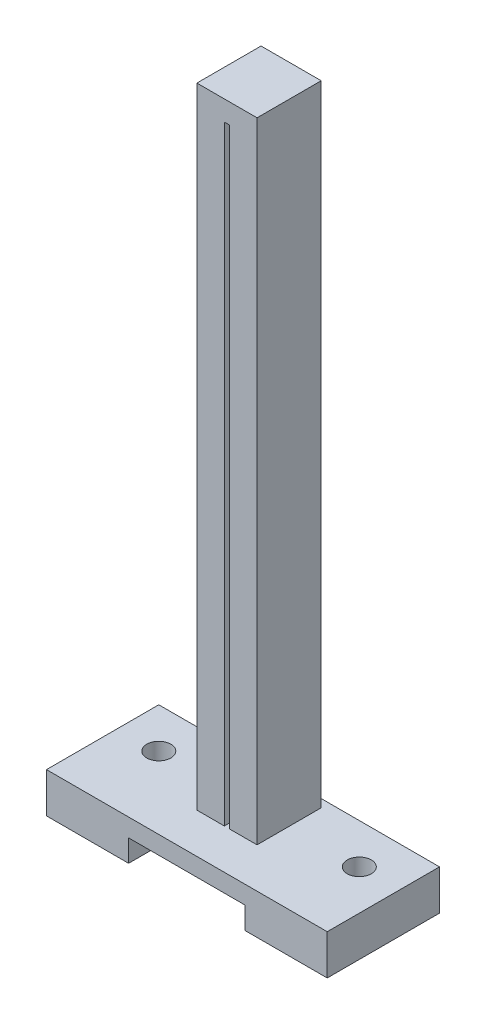
ISO-10303-21;
HEADER;
FILE_DESCRIPTION(('STEP AP214'),'2;1');
FILE_NAME('part.step','',(''),(''),'','','');
FILE_SCHEMA(('AUTOMOTIVE_DESIGN { 1 0 10303 214 1 1 1 1 }'));
ENDSEC;
DATA;
#1=APPLICATION_CONTEXT('core data for automotive mechanical design processes');
#2=APPLICATION_PROTOCOL_DEFINITION('international standard','automotive_design',2000,#1);
#3=PRODUCT_CONTEXT('',#1,'mechanical');
#4=PRODUCT('Part','Part','',(#3));
#5=PRODUCT_RELATED_PRODUCT_CATEGORY('part','',(#4));
#6=PRODUCT_DEFINITION_FORMATION('','',#4);
#7=PRODUCT_DEFINITION_CONTEXT('part definition',#1,'design');
#8=PRODUCT_DEFINITION('design','',#6,#7);
#9=PRODUCT_DEFINITION_SHAPE('','',#8);
#10=(LENGTH_UNIT() NAMED_UNIT(*) SI_UNIT(.MILLI.,.METRE.));
#11=(NAMED_UNIT(*) PLANE_ANGLE_UNIT() SI_UNIT($,.RADIAN.));
#12=(NAMED_UNIT(*) SI_UNIT($,.STERADIAN.) SOLID_ANGLE_UNIT());
#13=UNCERTAINTY_MEASURE_WITH_UNIT(LENGTH_MEASURE(1.E-05),#10,'distance_accuracy_value','');
#14=(GEOMETRIC_REPRESENTATION_CONTEXT(3) GLOBAL_UNCERTAINTY_ASSIGNED_CONTEXT((#13)) GLOBAL_UNIT_ASSIGNED_CONTEXT((#10,
#11,#12)) REPRESENTATION_CONTEXT('',''));
#15=CARTESIAN_POINT('',(0.,0.,0.));
#16=DIRECTION('',(0.,0.,1.));
#17=DIRECTION('',(1.,0.,0.));
#18=AXIS2_PLACEMENT_3D('',#15,#16,#17);
#19=CARTESIAN_POINT('',(-5.,5.5,21.5));
#20=DIRECTION('',(-1.,0.,0.));
#21=DIRECTION('',(0.,-1.,0.));
#22=AXIS2_PLACEMENT_3D('',#19,#20,#21);
#23=PLANE('',#22);
#24=DIRECTION('',(0.,1.,0.));
#25=VECTOR('',#24,1.);
#26=CARTESIAN_POINT('',(-5.,5.5,-13.5));
#27=LINE('',#26,#25);
#28=CARTESIAN_POINT('',(-5.,0.,-13.5));
#29=VERTEX_POINT('',#28);
#30=CARTESIAN_POINT('',(-5.,5.5,-13.5));
#31=VERTEX_POINT('',#30);
#32=EDGE_CURVE('E256',#29,#31,#27,.T.);
#33=ORIENTED_EDGE('',*,*,#32,.F.);
#34=DIRECTION('',(0.,0.,1.));
#35=VECTOR('',#34,1.);
#36=CARTESIAN_POINT('',(-5.,0.,0.));
#37=LINE('',#36,#35);
#38=CARTESIAN_POINT('',(-5.,0.,-21.5));
#39=VERTEX_POINT('',#38);
#40=EDGE_CURVE('E423',#39,#29,#37,.T.);
#41=ORIENTED_EDGE('',*,*,#40,.F.);
#42=DIRECTION('',(0.,1.,0.));
#43=VECTOR('',#42,1.);
#44=CARTESIAN_POINT('',(-5.,5.5,-21.5));
#45=LINE('',#44,#43);
#46=CARTESIAN_POINT('',(-5.,5.5,-21.5));
#47=VERTEX_POINT('',#46);
#48=EDGE_CURVE('E304',#39,#47,#45,.T.);
#49=ORIENTED_EDGE('',*,*,#48,.T.);
#50=DIRECTION('',(0.,0.,-1.));
#51=VECTOR('',#50,1.);
#52=CARTESIAN_POINT('',(-5.,5.5,21.5));
#53=LINE('',#52,#51);
#54=EDGE_CURVE('E313',#31,#47,#53,.T.);
#55=ORIENTED_EDGE('',*,*,#54,.F.);
#56=EDGE_LOOP('',(#33,#41,#49,#55));
#57=FACE_BOUND('',#56,.T.);
#58=ADVANCED_FACE('F32',(#57),#23,.F.);
#59=CARTESIAN_POINT('',(5.,5.5,21.5));
#60=DIRECTION('',(1.,0.,0.));
#61=DIRECTION('',(0.,1.,0.));
#62=AXIS2_PLACEMENT_3D('',#59,#60,#61);
#63=PLANE('',#62);
#64=DIRECTION('',(0.,-1.,0.));
#65=VECTOR('',#64,1.);
#66=CARTESIAN_POINT('',(5.,5.5,-13.5));
#67=LINE('',#66,#65);
#68=CARTESIAN_POINT('',(5.,5.5,-13.5));
#69=VERTEX_POINT('',#68);
#70=CARTESIAN_POINT('',(5.,0.,-13.5));
#71=VERTEX_POINT('',#70);
#72=EDGE_CURVE('E253',#69,#71,#67,.T.);
#73=ORIENTED_EDGE('',*,*,#72,.F.);
#74=DIRECTION('',(0.,0.,-1.));
#75=VECTOR('',#74,1.);
#76=CARTESIAN_POINT('',(5.,5.5,21.5));
#77=LINE('',#76,#75);
#78=CARTESIAN_POINT('',(5.,5.5,-21.5));
#79=VERTEX_POINT('',#78);
#80=EDGE_CURVE('E240',#69,#79,#77,.T.);
#81=ORIENTED_EDGE('',*,*,#80,.T.);
#82=DIRECTION('',(0.,-1.,0.));
#83=VECTOR('',#82,1.);
#84=CARTESIAN_POINT('',(5.,5.5,-21.5));
#85=LINE('',#84,#83);
#86=CARTESIAN_POINT('',(5.,0.,-21.5));
#87=VERTEX_POINT('',#86);
#88=EDGE_CURVE('E310',#79,#87,#85,.T.);
#89=ORIENTED_EDGE('',*,*,#88,.T.);
#90=DIRECTION('',(0.,0.,-1.));
#91=VECTOR('',#90,1.);
#92=CARTESIAN_POINT('',(5.,0.,0.));
#93=LINE('',#92,#91);
#94=EDGE_CURVE('E421',#71,#87,#93,.T.);
#95=ORIENTED_EDGE('',*,*,#94,.F.);
#96=EDGE_LOOP('',(#73,#81,#89,#95));
#97=FACE_BOUND('',#96,.T.);
#98=ADVANCED_FACE('F509',(#97),#63,.F.);
#99=CARTESIAN_POINT('',(0.,0.,0.));
#100=DIRECTION('',(0.,1.,0.));
#101=DIRECTION('',(0.,0.,1.));
#102=AXIS2_PLACEMENT_3D('',#99,#100,#101);
#103=PLANE('',#102);
#104=CARTESIAN_POINT('',(-25.,0.,-11.5));
#105=DIRECTION('',(0.,1.,0.));
#106=DIRECTION('',(0.,0.,1.));
#107=AXIS2_PLACEMENT_3D('',#104,#105,#106);
#108=CIRCLE('',#107,3.);
#109=CARTESIAN_POINT('',(-25.,0.,-8.5));
#110=VERTEX_POINT('',#109);
#111=EDGE_CURVE('E387',#110,#110,#108,.T.);
#112=ORIENTED_EDGE('',*,*,#111,.T.);
#113=EDGE_LOOP('',(#112));
#114=FACE_BOUND('',#113,.T.);
#115=DIRECTION('',(1.,0.,0.));
#116=VECTOR('',#115,1.);
#117=CARTESIAN_POINT('',(0.,0.,-13.5));
#118=LINE('',#117,#116);
#119=CARTESIAN_POINT('',(-14.5226475214995,0.,-13.5));
#120=VERTEX_POINT('',#119);
#121=EDGE_CURVE('E258',#120,#29,#118,.T.);
#122=ORIENTED_EDGE('',*,*,#121,.F.);
#123=DIRECTION('',(0.,0.,1.));
#124=VECTOR('',#123,1.);
#125=CARTESIAN_POINT('',(-14.5226475214995,0.,0.));
#126=LINE('',#125,#124);
#127=CARTESIAN_POINT('',(-14.5226475214995,0.,6.5));
#128=VERTEX_POINT('',#127);
#129=EDGE_CURVE('E247',#120,#128,#126,.T.);
#130=ORIENTED_EDGE('',*,*,#129,.T.);
#131=DIRECTION('',(-1.,0.,0.));
#132=VECTOR('',#131,1.);
#133=CARTESIAN_POINT('',(35.,0.,6.49999999999999));
#134=LINE('',#133,#132);
#135=CARTESIAN_POINT('',(-35.,0.,6.5));
#136=VERTEX_POINT('',#135);
#137=EDGE_CURVE('E299',#128,#136,#134,.T.);
#138=ORIENTED_EDGE('',*,*,#137,.T.);
#139=DIRECTION('',(0.,0.,1.));
#140=VECTOR('',#139,1.);
#141=CARTESIAN_POINT('',(-35.,0.,-21.5));
#142=LINE('',#141,#140);
#143=CARTESIAN_POINT('',(-35.,0.,-21.5));
#144=VERTEX_POINT('',#143);
#145=EDGE_CURVE('E396',#144,#136,#142,.T.);
#146=ORIENTED_EDGE('',*,*,#145,.F.);
#147=DIRECTION('',(-1.,0.,0.));
#148=VECTOR('',#147,1.);
#149=CARTESIAN_POINT('',(-35.,0.,-21.5));
#150=LINE('',#149,#148);
#151=EDGE_CURVE('E403',#39,#144,#150,.T.);
#152=ORIENTED_EDGE('',*,*,#151,.F.);
#153=ORIENTED_EDGE('',*,*,#40,.T.);
#154=EDGE_LOOP('',(#122,#130,#138,#146,#152,#153));
#155=FACE_BOUND('',#154,.T.);
#156=ADVANCED_FACE('F515',(#114,#155),#103,.F.);
#157=CARTESIAN_POINT('',(0.,10.,0.));
#158=DIRECTION('',(0.,1.,0.));
#159=DIRECTION('',(0.,0.,1.));
#160=AXIS2_PLACEMENT_3D('',#157,#158,#159);
#161=PLANE('',#160);
#162=DIRECTION('',(-1.,0.,0.));
#163=VECTOR('',#162,1.);
#164=CARTESIAN_POINT('',(35.,10.,6.49999999999999));
#165=LINE('',#164,#163);
#166=CARTESIAN_POINT('',(35.,10.,6.49999999999999));
#167=VERTEX_POINT('',#166);
#168=CARTESIAN_POINT('',(-35.,10.,6.5));
#169=VERTEX_POINT('',#168);
#170=EDGE_CURVE('E294',#167,#169,#165,.T.);
#171=ORIENTED_EDGE('',*,*,#170,.F.);
#172=DIRECTION('',(0.,0.,-1.));
#173=VECTOR('',#172,1.);
#174=CARTESIAN_POINT('',(35.,10.,-21.5));
#175=LINE('',#174,#173);
#176=CARTESIAN_POINT('',(35.,10.,-21.5));
#177=VERTEX_POINT('',#176);
#178=EDGE_CURVE('E393',#167,#177,#175,.T.);
#179=ORIENTED_EDGE('',*,*,#178,.T.);
#180=DIRECTION('',(-1.,0.,0.));
#181=VECTOR('',#180,1.);
#182=CARTESIAN_POINT('',(-35.,10.,-21.5));
#183=LINE('',#182,#181);
#184=CARTESIAN_POINT('',(-35.,10.,-21.5));
#185=VERTEX_POINT('',#184);
#186=EDGE_CURVE('E395',#177,#185,#183,.T.);
#187=ORIENTED_EDGE('',*,*,#186,.T.);
#188=DIRECTION('',(0.,0.,1.));
#189=VECTOR('',#188,1.);
#190=CARTESIAN_POINT('',(-35.,10.,-21.5));
#191=LINE('',#190,#189);
#192=EDGE_CURVE('E398',#185,#169,#191,.T.);
#193=ORIENTED_EDGE('',*,*,#192,.T.);
#194=EDGE_LOOP('',(#171,#179,#187,#193));
#195=FACE_BOUND('',#194,.T.);
#196=DIRECTION('',(-1.,0.,0.));
#197=VECTOR('',#196,1.);
#198=CARTESIAN_POINT('',(-3.825,10.,-17.5000000000061));
#199=LINE('',#198,#197);
#200=CARTESIAN_POINT('',(0.650000000006676,10.,-17.5000000000061));
#201=VERTEX_POINT('',#200);
#202=CARTESIAN_POINT('',(-0.649999999993325,10.,-17.5000000000061));
#203=VERTEX_POINT('',#202);
#204=EDGE_CURVE('E325',#201,#203,#199,.T.);
#205=ORIENTED_EDGE('',*,*,#204,.F.);
#206=DIRECTION('',(0.,0.,1.));
#207=VECTOR('',#206,1.);
#208=CARTESIAN_POINT('',(0.650000000006675,10.,-21.5));
#209=LINE('',#208,#207);
#210=CARTESIAN_POINT('',(0.650000000006675,10.,-19.5000000000061));
#211=VERTEX_POINT('',#210);
#212=EDGE_CURVE('E334',#211,#201,#209,.T.);
#213=ORIENTED_EDGE('',*,*,#212,.F.);
#214=DIRECTION('',(-1.,0.,0.));
#215=VECTOR('',#214,1.);
#216=CARTESIAN_POINT('',(-7.4999999999967,10.,-19.5000000000061));
#217=LINE('',#216,#215);
#218=CARTESIAN_POINT('',(7.5000000000033,10.,-19.5000000000061));
#219=VERTEX_POINT('',#218);
#220=EDGE_CURVE('E348',#219,#211,#217,.T.);
#221=ORIENTED_EDGE('',*,*,#220,.F.);
#222=DIRECTION('',(0.,0.,-1.));
#223=VECTOR('',#222,1.);
#224=CARTESIAN_POINT('',(7.5000000000033,10.,-17.5000000000061));
#225=LINE('',#224,#223);
#226=CARTESIAN_POINT('',(7.50000000000331,10.,-3.50000000000614));
#227=VERTEX_POINT('',#226);
#228=EDGE_CURVE('E374',#227,#219,#225,.T.);
#229=ORIENTED_EDGE('',*,*,#228,.F.);
#230=DIRECTION('',(1.,0.,0.));
#231=VECTOR('',#230,1.);
#232=CARTESIAN_POINT('',(-7.49999999999669,10.,-3.50000000000614));
#233=LINE('',#232,#231);
#234=CARTESIAN_POINT('',(0.650000000006675,10.,-3.50000000000614));
#235=VERTEX_POINT('',#234);
#236=EDGE_CURVE('E355',#235,#227,#233,.T.);
#237=ORIENTED_EDGE('',*,*,#236,.F.);
#238=CARTESIAN_POINT('',(0.650000000006676,10.,-5.50000000000614));
#239=VERTEX_POINT('',#238);
#240=EDGE_CURVE('E332',#239,#235,#209,.T.);
#241=ORIENTED_EDGE('',*,*,#240,.F.);
#242=DIRECTION('',(1.,0.,0.));
#243=VECTOR('',#242,1.);
#244=CARTESIAN_POINT('',(-3.825,10.,-5.50000000000614));
#245=LINE('',#244,#243);
#246=CARTESIAN_POINT('',(-0.649999999993326,10.,-5.50000000000614));
#247=VERTEX_POINT('',#246);
#248=EDGE_CURVE('E323',#247,#239,#245,.T.);
#249=ORIENTED_EDGE('',*,*,#248,.F.);
#250=DIRECTION('',(0.,0.,1.));
#251=VECTOR('',#250,1.);
#252=CARTESIAN_POINT('',(-0.649999999993325,10.,-21.5));
#253=LINE('',#252,#251);
#254=CARTESIAN_POINT('',(-0.649999999993325,10.,-3.50000000000614));
#255=VERTEX_POINT('',#254);
#256=EDGE_CURVE('E331',#247,#255,#253,.T.);
#257=ORIENTED_EDGE('',*,*,#256,.T.);
#258=CARTESIAN_POINT('',(-7.49999999999669,10.,-3.50000000000614));
#259=VERTEX_POINT('',#258);
#260=EDGE_CURVE('E356',#259,#255,#233,.T.);
#261=ORIENTED_EDGE('',*,*,#260,.F.);
#262=DIRECTION('',(0.,0.,1.));
#263=VECTOR('',#262,1.);
#264=CARTESIAN_POINT('',(-7.4999999999967,10.,-17.5000000000061));
#265=LINE('',#264,#263);
#266=CARTESIAN_POINT('',(-7.4999999999967,10.,-19.5000000000061));
#267=VERTEX_POINT('',#266);
#268=EDGE_CURVE('E377',#267,#259,#265,.T.);
#269=ORIENTED_EDGE('',*,*,#268,.F.);
#270=CARTESIAN_POINT('',(-0.649999999993326,10.,-19.5000000000061));
#271=VERTEX_POINT('',#270);
#272=EDGE_CURVE('E347',#271,#267,#217,.T.);
#273=ORIENTED_EDGE('',*,*,#272,.F.);
#274=EDGE_CURVE('E335',#271,#203,#253,.T.);
#275=ORIENTED_EDGE('',*,*,#274,.T.);
#276=EDGE_LOOP('',(#205,#213,#221,#229,#237,#241,#249,#257,#261,#269,#273,#275));
#277=FACE_BOUND('',#276,.T.);
#278=CARTESIAN_POINT('',(25.,10.,-11.5));
#279=DIRECTION('',(0.,1.,0.));
#280=DIRECTION('',(0.,0.,1.));
#281=AXIS2_PLACEMENT_3D('',#278,#279,#280);
#282=CIRCLE('',#281,3.);
#283=CARTESIAN_POINT('',(25.,10.,-8.5));
#284=VERTEX_POINT('',#283);
#285=EDGE_CURVE('E380',#284,#284,#282,.T.);
#286=ORIENTED_EDGE('',*,*,#285,.F.);
#287=EDGE_LOOP('',(#286));
#288=FACE_BOUND('',#287,.T.);
#289=CARTESIAN_POINT('',(-25.,10.,-11.5));
#290=DIRECTION('',(0.,1.,0.));
#291=DIRECTION('',(0.,0.,1.));
#292=AXIS2_PLACEMENT_3D('',#289,#290,#291);
#293=CIRCLE('',#292,3.);
#294=CARTESIAN_POINT('',(-25.,10.,-8.5));
#295=VERTEX_POINT('',#294);
#296=EDGE_CURVE('E384',#295,#295,#293,.T.);
#297=ORIENTED_EDGE('',*,*,#296,.F.);
#298=EDGE_LOOP('',(#297));
#299=FACE_BOUND('',#298,.T.);
#300=ADVANCED_FACE('F467',(#195,#277,#288,#299),#161,.T.);
#301=CARTESIAN_POINT('',(35.,10.,-21.5));
#302=DIRECTION('',(-1.,0.,0.));
#303=DIRECTION('',(0.,0.,1.));
#304=AXIS2_PLACEMENT_3D('',#301,#302,#303);
#305=PLANE('',#304);
#306=ORIENTED_EDGE('',*,*,#178,.F.);
#307=DIRECTION('',(0.,1.,0.));
#308=VECTOR('',#307,1.);
#309=CARTESIAN_POINT('',(35.,0.,6.49999999999999));
#310=LINE('',#309,#308);
#311=CARTESIAN_POINT('',(35.,0.,6.49999999999999));
#312=VERTEX_POINT('',#311);
#313=EDGE_CURVE('E298',#312,#167,#310,.T.);
#314=ORIENTED_EDGE('',*,*,#313,.F.);
#315=DIRECTION('',(0.,0.,-1.));
#316=VECTOR('',#315,1.);
#317=CARTESIAN_POINT('',(35.,0.,-21.5));
#318=LINE('',#317,#316);
#319=CARTESIAN_POINT('',(35.,0.,-21.5));
#320=VERTEX_POINT('',#319);
#321=EDGE_CURVE('E390',#312,#320,#318,.T.);
#322=ORIENTED_EDGE('',*,*,#321,.T.);
#323=DIRECTION('',(0.,-1.,0.));
#324=VECTOR('',#323,1.);
#325=CARTESIAN_POINT('',(35.,10.,-21.5));
#326=LINE('',#325,#324);
#327=EDGE_CURVE('E411',#177,#320,#326,.T.);
#328=ORIENTED_EDGE('',*,*,#327,.F.);
#329=EDGE_LOOP('',(#306,#314,#322,#328));
#330=FACE_BOUND('',#329,.T.);
#331=ADVANCED_FACE('F34',(#330),#305,.F.);
#332=CARTESIAN_POINT('',(-35.,10.,-21.5));
#333=DIRECTION('',(0.,0.,1.));
#334=DIRECTION('',(1.,0.,0.));
#335=AXIS2_PLACEMENT_3D('',#332,#333,#334);
#336=PLANE('',#335);
#337=DIRECTION('',(1.,0.,0.));
#338=VECTOR('',#337,1.);
#339=CARTESIAN_POINT('',(5.,5.5,-21.5));
#340=LINE('',#339,#338);
#341=EDGE_CURVE('E308',#47,#79,#340,.T.);
#342=ORIENTED_EDGE('',*,*,#341,.F.);
#343=ORIENTED_EDGE('',*,*,#48,.F.);
#344=ORIENTED_EDGE('',*,*,#151,.T.);
#345=DIRECTION('',(0.,-1.,0.));
#346=VECTOR('',#345,1.);
#347=CARTESIAN_POINT('',(-35.,10.,-21.5));
#348=LINE('',#347,#346);
#349=EDGE_CURVE('E401',#185,#144,#348,.T.);
#350=ORIENTED_EDGE('',*,*,#349,.F.);
#351=ORIENTED_EDGE('',*,*,#186,.F.);
#352=ORIENTED_EDGE('',*,*,#327,.T.);
#353=EDGE_CURVE('E404',#320,#87,#150,.T.);
#354=ORIENTED_EDGE('',*,*,#353,.T.);
#355=ORIENTED_EDGE('',*,*,#88,.F.);
#356=EDGE_LOOP('',(#342,#343,#344,#350,#351,#352,#354,#355));
#357=FACE_BOUND('',#356,.T.);
#358=ADVANCED_FACE('F560',(#357),#336,.F.);
#359=CARTESIAN_POINT('',(-35.,10.,-21.5));
#360=DIRECTION('',(1.,0.,0.));
#361=DIRECTION('',(0.,0.,-1.));
#362=AXIS2_PLACEMENT_3D('',#359,#360,#361);
#363=PLANE('',#362);
#364=ORIENTED_EDGE('',*,*,#145,.T.);
#365=DIRECTION('',(0.,1.,0.));
#366=VECTOR('',#365,1.);
#367=CARTESIAN_POINT('',(-35.,0.,6.5));
#368=LINE('',#367,#366);
#369=EDGE_CURVE('E301',#136,#169,#368,.T.);
#370=ORIENTED_EDGE('',*,*,#369,.T.);
#371=ORIENTED_EDGE('',*,*,#192,.F.);
#372=ORIENTED_EDGE('',*,*,#349,.T.);
#373=EDGE_LOOP('',(#364,#370,#371,#372));
#374=FACE_BOUND('',#373,.T.);
#375=ADVANCED_FACE('F564',(#374),#363,.F.);
#376=CARTESIAN_POINT('',(25.,0.,-11.5));
#377=DIRECTION('',(0.,1.,0.));
#378=DIRECTION('',(0.,0.,1.));
#379=AXIS2_PLACEMENT_3D('',#376,#377,#378);
#380=CIRCLE('',#379,3.);
#381=CARTESIAN_POINT('',(25.,0.,-8.5));
#382=VERTEX_POINT('',#381);
#383=EDGE_CURVE('E381',#382,#382,#380,.T.);
#384=ORIENTED_EDGE('',*,*,#383,.T.);
#385=EDGE_LOOP('',(#384));
#386=FACE_BOUND('',#385,.T.);
#387=CARTESIAN_POINT('',(14.5226475214995,0.,6.5));
#388=VERTEX_POINT('',#387);
#389=EDGE_CURVE('E295',#312,#388,#134,.T.);
#390=ORIENTED_EDGE('',*,*,#389,.T.);
#391=DIRECTION('',(0.,0.,-1.));
#392=VECTOR('',#391,1.);
#393=CARTESIAN_POINT('',(14.5226475214995,0.,0.));
#394=LINE('',#393,#392);
#395=CARTESIAN_POINT('',(14.5226475214995,0.,-13.5));
#396=VERTEX_POINT('',#395);
#397=EDGE_CURVE('E251',#388,#396,#394,.T.);
#398=ORIENTED_EDGE('',*,*,#397,.T.);
#399=DIRECTION('',(1.,0.,0.));
#400=VECTOR('',#399,1.);
#401=CARTESIAN_POINT('',(0.,0.,-13.5));
#402=LINE('',#401,#400);
#403=EDGE_CURVE('E224',#71,#396,#402,.T.);
#404=ORIENTED_EDGE('',*,*,#403,.F.);
#405=ORIENTED_EDGE('',*,*,#94,.T.);
#406=ORIENTED_EDGE('',*,*,#353,.F.);
#407=ORIENTED_EDGE('',*,*,#321,.F.);
#408=EDGE_LOOP('',(#390,#398,#404,#405,#406,#407));
#409=FACE_BOUND('',#408,.T.);
#410=ADVANCED_FACE('F575',(#386,#409),#103,.F.);
#411=CARTESIAN_POINT('',(-25.,0.,-11.5));
#412=DIRECTION('',(0.,1.,0.));
#413=DIRECTION('',(0.,0.,1.));
#414=AXIS2_PLACEMENT_3D('',#411,#412,#413);
#415=CYLINDRICAL_SURFACE('',#414,3.);
#416=ORIENTED_EDGE('',*,*,#111,.F.);
#417=EDGE_LOOP('',(#416));
#418=FACE_BOUND('',#417,.T.);
#419=ORIENTED_EDGE('',*,*,#296,.T.);
#420=EDGE_LOOP('',(#419));
#421=FACE_BOUND('',#420,.T.);
#422=ADVANCED_FACE('F580',(#418,#421),#415,.F.);
#423=CARTESIAN_POINT('',(25.,0.,-11.5));
#424=DIRECTION('',(0.,1.,0.));
#425=DIRECTION('',(0.,0.,1.));
#426=AXIS2_PLACEMENT_3D('',#423,#424,#425);
#427=CYLINDRICAL_SURFACE('',#426,3.);
#428=ORIENTED_EDGE('',*,*,#383,.F.);
#429=EDGE_LOOP('',(#428));
#430=FACE_BOUND('',#429,.T.);
#431=ORIENTED_EDGE('',*,*,#285,.T.);
#432=EDGE_LOOP('',(#431));
#433=FACE_BOUND('',#432,.T.);
#434=ADVANCED_FACE('F587',(#430,#433),#427,.F.);
#435=CARTESIAN_POINT('',(7.5000000000033,210.,-17.5000000000061));
#436=DIRECTION('',(-1.,0.,0.));
#437=DIRECTION('',(0.,0.,1.));
#438=AXIS2_PLACEMENT_3D('',#435,#436,#437);
#439=PLANE('',#438);
#440=DIRECTION('',(0.,-1.,0.));
#441=VECTOR('',#440,1.);
#442=CARTESIAN_POINT('',(7.5000000000033,210.,-19.5000000000061));
#443=LINE('',#442,#441);
#444=CARTESIAN_POINT('',(7.5000000000033,167.,-19.5000000000061));
#445=VERTEX_POINT('',#444);
#446=EDGE_CURVE('E353',#445,#219,#443,.T.);
#447=ORIENTED_EDGE('',*,*,#446,.F.);
#448=DIRECTION('',(0.,0.,-1.));
#449=VECTOR('',#448,1.);
#450=CARTESIAN_POINT('',(7.5000000000033,167.,-3.50000000000614));
#451=LINE('',#450,#449);
#452=CARTESIAN_POINT('',(7.5000000000033,167.,-3.50000000000614));
#453=VERTEX_POINT('',#452);
#454=EDGE_CURVE('E268',#453,#445,#451,.T.);
#455=ORIENTED_EDGE('',*,*,#454,.F.);
#456=DIRECTION('',(0.,-1.,0.));
#457=VECTOR('',#456,1.);
#458=CARTESIAN_POINT('',(7.50000000000331,210.,-3.50000000000614));
#459=LINE('',#458,#457);
#460=EDGE_CURVE('E359',#453,#227,#459,.T.);
#461=ORIENTED_EDGE('',*,*,#460,.T.);
#462=ORIENTED_EDGE('',*,*,#228,.T.);
#463=EDGE_LOOP('',(#447,#455,#461,#462));
#464=FACE_BOUND('',#463,.T.);
#465=ADVANCED_FACE('F477',(#464),#439,.F.);
#466=CARTESIAN_POINT('',(-7.4999999999967,210.,-17.5000000000061));
#467=DIRECTION('',(1.,0.,0.));
#468=DIRECTION('',(0.,0.,-1.));
#469=AXIS2_PLACEMENT_3D('',#466,#467,#468);
#470=PLANE('',#469);
#471=DIRECTION('',(0.,-1.,0.));
#472=VECTOR('',#471,1.);
#473=CARTESIAN_POINT('',(-7.49999999999669,210.,-3.50000000000614));
#474=LINE('',#473,#472);
#475=CARTESIAN_POINT('',(-7.4999999999967,167.,-3.50000000000614));
#476=VERTEX_POINT('',#475);
#477=EDGE_CURVE('E361',#476,#259,#474,.T.);
#478=ORIENTED_EDGE('',*,*,#477,.F.);
#479=DIRECTION('',(0.,0.,1.));
#480=VECTOR('',#479,1.);
#481=CARTESIAN_POINT('',(-7.4999999999967,167.,-3.50000000000614));
#482=LINE('',#481,#480);
#483=CARTESIAN_POINT('',(-7.4999999999967,167.,-19.5000000000061));
#484=VERTEX_POINT('',#483);
#485=EDGE_CURVE('E261',#484,#476,#482,.T.);
#486=ORIENTED_EDGE('',*,*,#485,.F.);
#487=DIRECTION('',(0.,-1.,0.));
#488=VECTOR('',#487,1.);
#489=CARTESIAN_POINT('',(-7.4999999999967,210.,-19.5000000000061));
#490=LINE('',#489,#488);
#491=EDGE_CURVE('E351',#484,#267,#490,.T.);
#492=ORIENTED_EDGE('',*,*,#491,.T.);
#493=ORIENTED_EDGE('',*,*,#268,.T.);
#494=EDGE_LOOP('',(#478,#486,#492,#493));
#495=FACE_BOUND('',#494,.T.);
#496=ADVANCED_FACE('F489',(#495),#470,.F.);
#497=CARTESIAN_POINT('',(-3.82499999999999,210.,21.5));
#498=DIRECTION('',(-1.,0.,0.));
#499=DIRECTION('',(0.,-1.,0.));
#500=AXIS2_PLACEMENT_3D('',#497,#498,#499);
#501=PLANE('',#500);
#502=DIRECTION('',(0.,1.,0.));
#503=VECTOR('',#502,1.);
#504=CARTESIAN_POINT('',(-3.82499999999999,210.,-17.5000000000061));
#505=LINE('',#504,#503);
#506=CARTESIAN_POINT('',(-3.825,5.50000000000001,-17.5000000000061));
#507=VERTEX_POINT('',#506);
#508=CARTESIAN_POINT('',(-3.82499999999999,162.,-17.5000000000061));
#509=VERTEX_POINT('',#508);
#510=EDGE_CURVE('E363',#507,#509,#505,.T.);
#511=ORIENTED_EDGE('',*,*,#510,.T.);
#512=DIRECTION('',(0.,0.,1.));
#513=VECTOR('',#512,1.);
#514=CARTESIAN_POINT('',(-3.82499999999999,162.,21.5));
#515=LINE('',#514,#513);
#516=CARTESIAN_POINT('',(-3.825,162.,-5.50000000000614));
#517=VERTEX_POINT('',#516);
#518=EDGE_CURVE('E280',#509,#517,#515,.T.);
#519=ORIENTED_EDGE('',*,*,#518,.T.);
#520=DIRECTION('',(0.,1.,0.));
#521=VECTOR('',#520,1.);
#522=CARTESIAN_POINT('',(-3.82499999999999,210.,-5.50000000000614));
#523=LINE('',#522,#521);
#524=CARTESIAN_POINT('',(-3.82500000000001,5.50000000000001,-5.50000000000614));
#525=VERTEX_POINT('',#524);
#526=EDGE_CURVE('E371',#525,#517,#523,.T.);
#527=ORIENTED_EDGE('',*,*,#526,.F.);
#528=DIRECTION('',(0.,0.,-1.));
#529=VECTOR('',#528,1.);
#530=CARTESIAN_POINT('',(-3.82500000000001,5.50000000000001,21.5));
#531=LINE('',#530,#529);
#532=EDGE_CURVE('E318',#525,#507,#531,.T.);
#533=ORIENTED_EDGE('',*,*,#532,.T.);
#534=EDGE_LOOP('',(#511,#519,#527,#533));
#535=FACE_BOUND('',#534,.T.);
#536=ADVANCED_FACE('F460',(#535),#501,.F.);
#537=CARTESIAN_POINT('',(3.82500000000001,210.,21.5));
#538=DIRECTION('',(1.,0.,0.));
#539=DIRECTION('',(0.,1.,0.));
#540=AXIS2_PLACEMENT_3D('',#537,#538,#539);
#541=PLANE('',#540);
#542=DIRECTION('',(0.,-1.,0.));
#543=VECTOR('',#542,1.);
#544=CARTESIAN_POINT('',(3.82500000000001,210.,-5.50000000000614));
#545=LINE('',#544,#543);
#546=CARTESIAN_POINT('',(3.82500000000001,162.,-5.50000000000614));
#547=VERTEX_POINT('',#546);
#548=CARTESIAN_POINT('',(3.82499999999999,5.50000000000001,-5.50000000000614));
#549=VERTEX_POINT('',#548);
#550=EDGE_CURVE('E368',#547,#549,#545,.T.);
#551=ORIENTED_EDGE('',*,*,#550,.F.);
#552=DIRECTION('',(0.,0.,-1.));
#553=VECTOR('',#552,1.);
#554=CARTESIAN_POINT('',(3.82500000000001,162.,21.5));
#555=LINE('',#554,#553);
#556=CARTESIAN_POINT('',(3.82500000000001,162.,-17.5000000000061));
#557=VERTEX_POINT('',#556);
#558=EDGE_CURVE('E289',#547,#557,#555,.T.);
#559=ORIENTED_EDGE('',*,*,#558,.T.);
#560=DIRECTION('',(0.,-1.,0.));
#561=VECTOR('',#560,1.);
#562=CARTESIAN_POINT('',(3.82500000000001,210.,-17.5000000000061));
#563=LINE('',#562,#561);
#564=CARTESIAN_POINT('',(3.82499999999999,5.50000000000001,-17.5000000000061));
#565=VERTEX_POINT('',#564);
#566=EDGE_CURVE('E366',#557,#565,#563,.T.);
#567=ORIENTED_EDGE('',*,*,#566,.T.);
#568=DIRECTION('',(0.,0.,1.));
#569=VECTOR('',#568,1.);
#570=CARTESIAN_POINT('',(3.82499999999999,5.50000000000001,21.5));
#571=LINE('',#570,#569);
#572=EDGE_CURVE('E315',#565,#549,#571,.T.);
#573=ORIENTED_EDGE('',*,*,#572,.T.);
#574=EDGE_LOOP('',(#551,#559,#567,#573));
#575=FACE_BOUND('',#574,.T.);
#576=ADVANCED_FACE('F449',(#575),#541,.F.);
#577=CARTESIAN_POINT('',(-7.49999999999669,210.,-5.50000000000614));
#578=DIRECTION('',(0.,0.,1.));
#579=DIRECTION('',(1.,0.,0.));
#580=AXIS2_PLACEMENT_3D('',#577,#578,#579);
#581=PLANE('',#580);
#582=ORIENTED_EDGE('',*,*,#526,.T.);
#583=DIRECTION('',(1.,0.,0.));
#584=VECTOR('',#583,1.);
#585=CARTESIAN_POINT('',(-7.49999999999669,162.,-5.50000000000614));
#586=LINE('',#585,#584);
#587=CARTESIAN_POINT('',(-0.649999999993327,162.,-5.50000000000614));
#588=VERTEX_POINT('',#587);
#589=EDGE_CURVE('E274',#517,#588,#586,.T.);
#590=ORIENTED_EDGE('',*,*,#589,.T.);
#591=DIRECTION('',(0.,-1.,0.));
#592=VECTOR('',#591,1.);
#593=CARTESIAN_POINT('',(-0.649999999993328,210.,-5.50000000000614));
#594=LINE('',#593,#592);
#595=EDGE_CURVE('E341',#588,#247,#594,.T.);
#596=ORIENTED_EDGE('',*,*,#595,.T.);
#597=ORIENTED_EDGE('',*,*,#248,.T.);
#598=DIRECTION('',(0.,1.,0.));
#599=VECTOR('',#598,1.);
#600=CARTESIAN_POINT('',(0.650000000006673,210.,-5.50000000000614));
#601=LINE('',#600,#599);
#602=CARTESIAN_POINT('',(0.650000000006674,162.,-5.50000000000614));
#603=VERTEX_POINT('',#602);
#604=EDGE_CURVE('E345',#239,#603,#601,.T.);
#605=ORIENTED_EDGE('',*,*,#604,.T.);
#606=EDGE_CURVE('E281',#603,#547,#586,.T.);
#607=ORIENTED_EDGE('',*,*,#606,.T.);
#608=ORIENTED_EDGE('',*,*,#550,.T.);
#609=DIRECTION('',(-1.,0.,0.));
#610=VECTOR('',#609,1.);
#611=CARTESIAN_POINT('',(-7.49999999999669,5.50000000000001,-5.50000000000614));
#612=LINE('',#611,#610);
#613=EDGE_CURVE('E320',#549,#525,#612,.T.);
#614=ORIENTED_EDGE('',*,*,#613,.T.);
#615=EDGE_LOOP('',(#582,#590,#596,#597,#605,#607,#608,#614));
#616=FACE_BOUND('',#615,.T.);
#617=ADVANCED_FACE('F446',(#616),#581,.F.);
#618=CARTESIAN_POINT('',(-7.49999999999669,210.,-3.50000000000614));
#619=DIRECTION('',(0.,0.,-1.));
#620=DIRECTION('',(-1.,0.,0.));
#621=AXIS2_PLACEMENT_3D('',#618,#619,#620);
#622=PLANE('',#621);
#623=DIRECTION('',(0.,-1.,0.));
#624=VECTOR('',#623,1.);
#625=CARTESIAN_POINT('',(-0.649999999993327,210.,-3.50000000000614));
#626=LINE('',#625,#624);
#627=CARTESIAN_POINT('',(-0.649999999993327,162.,-3.50000000000614));
#628=VERTEX_POINT('',#627);
#629=EDGE_CURVE('E329',#628,#255,#626,.T.);
#630=ORIENTED_EDGE('',*,*,#629,.F.);
#631=DIRECTION('',(1.,0.,0.));
#632=VECTOR('',#631,1.);
#633=CARTESIAN_POINT('',(-7.4999999999967,162.,-3.50000000000614));
#634=LINE('',#633,#632);
#635=CARTESIAN_POINT('',(0.650000000006673,162.,-3.50000000000614));
#636=VERTEX_POINT('',#635);
#637=EDGE_CURVE('E260',#628,#636,#634,.T.);
#638=ORIENTED_EDGE('',*,*,#637,.T.);
#639=DIRECTION('',(0.,1.,0.));
#640=VECTOR('',#639,1.);
#641=CARTESIAN_POINT('',(0.650000000006673,210.,-3.50000000000614));
#642=LINE('',#641,#640);
#643=EDGE_CURVE('E327',#235,#636,#642,.T.);
#644=ORIENTED_EDGE('',*,*,#643,.F.);
#645=ORIENTED_EDGE('',*,*,#236,.T.);
#646=ORIENTED_EDGE('',*,*,#460,.F.);
#647=DIRECTION('',(1.,0.,0.));
#648=VECTOR('',#647,1.);
#649=CARTESIAN_POINT('',(-7.4999999999967,167.,-3.50000000000614));
#650=LINE('',#649,#648);
#651=EDGE_CURVE('E264',#476,#453,#650,.T.);
#652=ORIENTED_EDGE('',*,*,#651,.F.);
#653=ORIENTED_EDGE('',*,*,#477,.T.);
#654=ORIENTED_EDGE('',*,*,#260,.T.);
#655=EDGE_LOOP('',(#630,#638,#644,#645,#646,#652,#653,#654));
#656=FACE_BOUND('',#655,.T.);
#657=ADVANCED_FACE('F436',(#656),#622,.F.);
#658=CARTESIAN_POINT('',(-7.4999999999967,210.,-17.5000000000061));
#659=DIRECTION('',(0.,0.,-1.));
#660=DIRECTION('',(-1.,0.,0.));
#661=AXIS2_PLACEMENT_3D('',#658,#659,#660);
#662=PLANE('',#661);
#663=ORIENTED_EDGE('',*,*,#566,.F.);
#664=DIRECTION('',(-1.,0.,0.));
#665=VECTOR('',#664,1.);
#666=CARTESIAN_POINT('',(-7.4999999999967,162.,-17.5000000000061));
#667=LINE('',#666,#665);
#668=CARTESIAN_POINT('',(0.650000000006675,162.,-17.5000000000061));
#669=VERTEX_POINT('',#668);
#670=EDGE_CURVE('E286',#557,#669,#667,.T.);
#671=ORIENTED_EDGE('',*,*,#670,.T.);
#672=DIRECTION('',(0.,-1.,0.));
#673=VECTOR('',#672,1.);
#674=CARTESIAN_POINT('',(0.650000000006673,210.,-17.5000000000061));
#675=LINE('',#674,#673);
#676=EDGE_CURVE('E343',#669,#201,#675,.T.);
#677=ORIENTED_EDGE('',*,*,#676,.T.);
#678=ORIENTED_EDGE('',*,*,#204,.T.);
#679=DIRECTION('',(0.,1.,0.));
#680=VECTOR('',#679,1.);
#681=CARTESIAN_POINT('',(-0.649999999993328,210.,-17.5000000000061));
#682=LINE('',#681,#680);
#683=CARTESIAN_POINT('',(-0.649999999993326,162.,-17.5000000000061));
#684=VERTEX_POINT('',#683);
#685=EDGE_CURVE('E338',#203,#684,#682,.T.);
#686=ORIENTED_EDGE('',*,*,#685,.T.);
#687=EDGE_CURVE('E283',#684,#509,#667,.T.);
#688=ORIENTED_EDGE('',*,*,#687,.T.);
#689=ORIENTED_EDGE('',*,*,#510,.F.);
#690=DIRECTION('',(1.,0.,0.));
#691=VECTOR('',#690,1.);
#692=CARTESIAN_POINT('',(-7.4999999999967,5.50000000000001,-17.5000000000061));
#693=LINE('',#692,#691);
#694=EDGE_CURVE('E418',#507,#565,#693,.T.);
#695=ORIENTED_EDGE('',*,*,#694,.T.);
#696=EDGE_LOOP('',(#663,#671,#677,#678,#686,#688,#689,#695));
#697=FACE_BOUND('',#696,.T.);
#698=ADVANCED_FACE('F456',(#697),#662,.F.);
#699=CARTESIAN_POINT('',(-7.4999999999967,210.,-19.5000000000061));
#700=DIRECTION('',(0.,0.,1.));
#701=DIRECTION('',(1.,0.,0.));
#702=AXIS2_PLACEMENT_3D('',#699,#700,#701);
#703=PLANE('',#702);
#704=DIRECTION('',(0.,1.,0.));
#705=VECTOR('',#704,1.);
#706=CARTESIAN_POINT('',(0.650000000006673,210.,-19.5000000000061));
#707=LINE('',#706,#705);
#708=CARTESIAN_POINT('',(0.650000000006673,162.,-19.5000000000061));
#709=VERTEX_POINT('',#708);
#710=EDGE_CURVE('E416',#211,#709,#707,.T.);
#711=ORIENTED_EDGE('',*,*,#710,.T.);
#712=DIRECTION('',(-1.,0.,0.));
#713=VECTOR('',#712,1.);
#714=CARTESIAN_POINT('',(-7.4999999999967,162.,-19.5000000000061));
#715=LINE('',#714,#713);
#716=CARTESIAN_POINT('',(-0.649999999993327,162.,-19.5000000000061));
#717=VERTEX_POINT('',#716);
#718=EDGE_CURVE('E265',#709,#717,#715,.T.);
#719=ORIENTED_EDGE('',*,*,#718,.T.);
#720=DIRECTION('',(0.,-1.,0.));
#721=VECTOR('',#720,1.);
#722=CARTESIAN_POINT('',(-0.649999999993328,210.,-19.5000000000061));
#723=LINE('',#722,#721);
#724=EDGE_CURVE('E414',#717,#271,#723,.T.);
#725=ORIENTED_EDGE('',*,*,#724,.T.);
#726=ORIENTED_EDGE('',*,*,#272,.T.);
#727=ORIENTED_EDGE('',*,*,#491,.F.);
#728=DIRECTION('',(-1.,0.,0.));
#729=VECTOR('',#728,1.);
#730=CARTESIAN_POINT('',(-7.4999999999967,167.,-19.5000000000061));
#731=LINE('',#730,#729);
#732=EDGE_CURVE('E271',#445,#484,#731,.T.);
#733=ORIENTED_EDGE('',*,*,#732,.F.);
#734=ORIENTED_EDGE('',*,*,#446,.T.);
#735=ORIENTED_EDGE('',*,*,#220,.T.);
#736=EDGE_LOOP('',(#711,#719,#725,#726,#727,#733,#734,#735));
#737=FACE_BOUND('',#736,.T.);
#738=ADVANCED_FACE('F484',(#737),#703,.F.);
#739=CARTESIAN_POINT('',(-0.649999999993327,210.,-21.5));
#740=DIRECTION('',(-1.,0.,0.));
#741=DIRECTION('',(0.,-1.,0.));
#742=AXIS2_PLACEMENT_3D('',#739,#740,#741);
#743=PLANE('',#742);
#744=ORIENTED_EDGE('',*,*,#724,.F.);
#745=DIRECTION('',(0.,0.,1.));
#746=VECTOR('',#745,1.);
#747=CARTESIAN_POINT('',(-0.649999999993327,162.,-21.5));
#748=LINE('',#747,#746);
#749=EDGE_CURVE('E285',#717,#684,#748,.T.);
#750=ORIENTED_EDGE('',*,*,#749,.T.);
#751=ORIENTED_EDGE('',*,*,#685,.F.);
#752=ORIENTED_EDGE('',*,*,#274,.F.);
#753=EDGE_LOOP('',(#744,#750,#751,#752));
#754=FACE_BOUND('',#753,.T.);
#755=ADVANCED_FACE('F495',(#754),#743,.F.);
#756=CARTESIAN_POINT('',(0.650000000006673,210.,-21.5));
#757=DIRECTION('',(1.,0.,0.));
#758=DIRECTION('',(0.,1.,0.));
#759=AXIS2_PLACEMENT_3D('',#756,#757,#758);
#760=PLANE('',#759);
#761=ORIENTED_EDGE('',*,*,#676,.F.);
#762=DIRECTION('',(0.,0.,-1.));
#763=VECTOR('',#762,1.);
#764=CARTESIAN_POINT('',(0.650000000006673,162.,-21.5));
#765=LINE('',#764,#763);
#766=EDGE_CURVE('E291',#669,#709,#765,.T.);
#767=ORIENTED_EDGE('',*,*,#766,.T.);
#768=ORIENTED_EDGE('',*,*,#710,.F.);
#769=ORIENTED_EDGE('',*,*,#212,.T.);
#770=EDGE_LOOP('',(#761,#767,#768,#769));
#771=FACE_BOUND('',#770,.T.);
#772=ADVANCED_FACE('F498',(#771),#760,.F.);
#773=ORIENTED_EDGE('',*,*,#643,.T.);
#774=DIRECTION('',(0.,0.,-1.));
#775=VECTOR('',#774,1.);
#776=CARTESIAN_POINT('',(0.650000000006673,162.,-21.5));
#777=LINE('',#776,#775);
#778=EDGE_CURVE('E54',#636,#603,#777,.T.);
#779=ORIENTED_EDGE('',*,*,#778,.T.);
#780=ORIENTED_EDGE('',*,*,#604,.F.);
#781=ORIENTED_EDGE('',*,*,#240,.T.);
#782=EDGE_LOOP('',(#773,#779,#780,#781));
#783=FACE_BOUND('',#782,.T.);
#784=ADVANCED_FACE('F472',(#783),#760,.F.);
#785=ORIENTED_EDGE('',*,*,#595,.F.);
#786=DIRECTION('',(0.,0.,1.));
#787=VECTOR('',#786,1.);
#788=CARTESIAN_POINT('',(-0.649999999993327,162.,-21.5));
#789=LINE('',#788,#787);
#790=EDGE_CURVE('E40',#588,#628,#789,.T.);
#791=ORIENTED_EDGE('',*,*,#790,.T.);
#792=ORIENTED_EDGE('',*,*,#629,.T.);
#793=ORIENTED_EDGE('',*,*,#256,.F.);
#794=EDGE_LOOP('',(#785,#791,#792,#793));
#795=FACE_BOUND('',#794,.T.);
#796=ADVANCED_FACE('F430',(#795),#743,.F.);
#797=CARTESIAN_POINT('',(5.,5.5,21.5));
#798=DIRECTION('',(0.,1.,0.));
#799=DIRECTION('',(0.,0.,1.));
#800=AXIS2_PLACEMENT_3D('',#797,#798,#799);
#801=PLANE('',#800);
#802=ORIENTED_EDGE('',*,*,#694,.F.);
#803=ORIENTED_EDGE('',*,*,#532,.F.);
#804=ORIENTED_EDGE('',*,*,#613,.F.);
#805=ORIENTED_EDGE('',*,*,#572,.F.);
#806=EDGE_LOOP('',(#802,#803,#804,#805));
#807=FACE_BOUND('',#806,.T.);
#808=DIRECTION('',(-1.,0.,0.));
#809=VECTOR('',#808,1.);
#810=CARTESIAN_POINT('',(5.,5.5,6.5));
#811=LINE('',#810,#809);
#812=CARTESIAN_POINT('',(14.5226475214995,5.5,6.49999999999999));
#813=VERTEX_POINT('',#812);
#814=CARTESIAN_POINT('',(-14.5226475214995,5.5,6.5));
#815=VERTEX_POINT('',#814);
#816=EDGE_CURVE('E46',#813,#815,#811,.T.);
#817=ORIENTED_EDGE('',*,*,#816,.T.);
#818=DIRECTION('',(0.,0.,1.));
#819=VECTOR('',#818,1.);
#820=CARTESIAN_POINT('',(-14.5226475214995,5.5,-13.5));
#821=LINE('',#820,#819);
#822=CARTESIAN_POINT('',(-14.5226475214995,5.5,-13.5));
#823=VERTEX_POINT('',#822);
#824=EDGE_CURVE('E234',#823,#815,#821,.T.);
#825=ORIENTED_EDGE('',*,*,#824,.F.);
#826=DIRECTION('',(-1.,0.,0.));
#827=VECTOR('',#826,1.);
#828=CARTESIAN_POINT('',(-14.5226475214995,5.5,-13.5));
#829=LINE('',#828,#827);
#830=EDGE_CURVE('E227',#31,#823,#829,.T.);
#831=ORIENTED_EDGE('',*,*,#830,.F.);
#832=ORIENTED_EDGE('',*,*,#54,.T.);
#833=ORIENTED_EDGE('',*,*,#341,.T.);
#834=ORIENTED_EDGE('',*,*,#80,.F.);
#835=CARTESIAN_POINT('',(14.5226475214995,5.5,-13.5));
#836=VERTEX_POINT('',#835);
#837=EDGE_CURVE('E221',#836,#69,#829,.T.);
#838=ORIENTED_EDGE('',*,*,#837,.F.);
#839=DIRECTION('',(0.,0.,1.));
#840=VECTOR('',#839,1.);
#841=CARTESIAN_POINT('',(14.5226475214995,5.5,-13.5));
#842=LINE('',#841,#840);
#843=EDGE_CURVE('E231',#836,#813,#842,.T.);
#844=ORIENTED_EDGE('',*,*,#843,.T.);
#845=EDGE_LOOP('',(#817,#825,#831,#832,#833,#834,#838,#844));
#846=FACE_BOUND('',#845,.T.);
#847=ADVANCED_FACE('F238',(#807,#846),#801,.F.);
#848=CARTESIAN_POINT('',(35.,0.,6.49999999999999));
#849=DIRECTION('',(0.,0.,-1.));
#850=DIRECTION('',(-1.,0.,0.));
#851=AXIS2_PLACEMENT_3D('',#848,#849,#850);
#852=PLANE('',#851);
#853=ORIENTED_EDGE('',*,*,#137,.F.);
#854=DIRECTION('',(0.,-1.,0.));
#855=VECTOR('',#854,1.);
#856=CARTESIAN_POINT('',(-14.5226475214995,5.5,6.5));
#857=LINE('',#856,#855);
#858=EDGE_CURVE('E228',#815,#128,#857,.T.);
#859=ORIENTED_EDGE('',*,*,#858,.F.);
#860=ORIENTED_EDGE('',*,*,#816,.F.);
#861=DIRECTION('',(0.,-1.,0.));
#862=VECTOR('',#861,1.);
#863=CARTESIAN_POINT('',(14.5226475214995,0.,6.49999999999999));
#864=LINE('',#863,#862);
#865=EDGE_CURVE('E11',#813,#388,#864,.T.);
#866=ORIENTED_EDGE('',*,*,#865,.T.);
#867=ORIENTED_EDGE('',*,*,#389,.F.);
#868=ORIENTED_EDGE('',*,*,#313,.T.);
#869=ORIENTED_EDGE('',*,*,#170,.T.);
#870=ORIENTED_EDGE('',*,*,#369,.F.);
#871=EDGE_LOOP('',(#853,#859,#860,#866,#867,#868,#869,#870));
#872=FACE_BOUND('',#871,.T.);
#873=ADVANCED_FACE('F524',(#872),#852,.F.);
#874=CARTESIAN_POINT('',(0.,162.,0.));
#875=DIRECTION('',(0.,-1.,0.));
#876=DIRECTION('',(0.,0.,-1.));
#877=AXIS2_PLACEMENT_3D('',#874,#875,#876);
#878=PLANE('',#877);
#879=ORIENTED_EDGE('',*,*,#766,.F.);
#880=ORIENTED_EDGE('',*,*,#670,.F.);
#881=ORIENTED_EDGE('',*,*,#558,.F.);
#882=ORIENTED_EDGE('',*,*,#606,.F.);
#883=ORIENTED_EDGE('',*,*,#778,.F.);
#884=ORIENTED_EDGE('',*,*,#637,.F.);
#885=ORIENTED_EDGE('',*,*,#790,.F.);
#886=ORIENTED_EDGE('',*,*,#589,.F.);
#887=ORIENTED_EDGE('',*,*,#518,.F.);
#888=ORIENTED_EDGE('',*,*,#687,.F.);
#889=ORIENTED_EDGE('',*,*,#749,.F.);
#890=ORIENTED_EDGE('',*,*,#718,.F.);
#891=EDGE_LOOP('',(#879,#880,#881,#882,#883,#884,#885,#886,#887,#888,#889,#890));
#892=FACE_BOUND('',#891,.T.);
#893=ADVANCED_FACE('F440',(#892),#878,.T.);
#894=CARTESIAN_POINT('',(0.,167.,0.));
#895=DIRECTION('',(0.,-1.,0.));
#896=DIRECTION('',(0.,0.,-1.));
#897=AXIS2_PLACEMENT_3D('',#894,#895,#896);
#898=PLANE('',#897);
#899=ORIENTED_EDGE('',*,*,#485,.T.);
#900=ORIENTED_EDGE('',*,*,#651,.T.);
#901=ORIENTED_EDGE('',*,*,#454,.T.);
#902=ORIENTED_EDGE('',*,*,#732,.T.);
#903=EDGE_LOOP('',(#899,#900,#901,#902));
#904=FACE_BOUND('',#903,.T.);
#905=ADVANCED_FACE('F481',(#904),#898,.F.);
#906=CARTESIAN_POINT('',(14.5226475214995,5.5,-13.5));
#907=DIRECTION('',(1.,0.,0.));
#908=DIRECTION('',(0.,1.,0.));
#909=AXIS2_PLACEMENT_3D('',#906,#907,#908);
#910=PLANE('',#909);
#911=ORIENTED_EDGE('',*,*,#865,.F.);
#912=ORIENTED_EDGE('',*,*,#843,.F.);
#913=DIRECTION('',(0.,1.,0.));
#914=VECTOR('',#913,1.);
#915=CARTESIAN_POINT('',(14.5226475214995,5.5,-13.5));
#916=LINE('',#915,#914);
#917=EDGE_CURVE('E217',#396,#836,#916,.T.);
#918=ORIENTED_EDGE('',*,*,#917,.F.);
#919=ORIENTED_EDGE('',*,*,#397,.F.);
#920=EDGE_LOOP('',(#911,#912,#918,#919));
#921=FACE_BOUND('',#920,.T.);
#922=ADVANCED_FACE('F232',(#921),#910,.F.);
#923=CARTESIAN_POINT('',(0.,0.,-13.5));
#924=DIRECTION('',(0.,0.,1.));
#925=DIRECTION('',(1.,0.,0.));
#926=AXIS2_PLACEMENT_3D('',#923,#924,#925);
#927=PLANE('',#926);
#928=ORIENTED_EDGE('',*,*,#403,.T.);
#929=ORIENTED_EDGE('',*,*,#917,.T.);
#930=ORIENTED_EDGE('',*,*,#837,.T.);
#931=ORIENTED_EDGE('',*,*,#72,.T.);
#932=EDGE_LOOP('',(#928,#929,#930,#931));
#933=FACE_BOUND('',#932,.T.);
#934=ADVANCED_FACE('F219',(#933),#927,.T.);
#935=ORIENTED_EDGE('',*,*,#121,.T.);
#936=ORIENTED_EDGE('',*,*,#32,.T.);
#937=ORIENTED_EDGE('',*,*,#830,.T.);
#938=DIRECTION('',(0.,-1.,0.));
#939=VECTOR('',#938,1.);
#940=CARTESIAN_POINT('',(-14.5226475214995,5.5,-13.5));
#941=LINE('',#940,#939);
#942=EDGE_CURVE('E235',#823,#120,#941,.T.);
#943=ORIENTED_EDGE('',*,*,#942,.T.);
#944=EDGE_LOOP('',(#935,#936,#937,#943));
#945=FACE_BOUND('',#944,.T.);
#946=ADVANCED_FACE('F542',(#945),#927,.T.);
#947=CARTESIAN_POINT('',(-14.5226475214995,5.5,-13.5));
#948=DIRECTION('',(-1.,0.,0.));
#949=DIRECTION('',(0.,0.,1.));
#950=AXIS2_PLACEMENT_3D('',#947,#948,#949);
#951=PLANE('',#950);
#952=ORIENTED_EDGE('',*,*,#942,.F.);
#953=ORIENTED_EDGE('',*,*,#824,.T.);
#954=ORIENTED_EDGE('',*,*,#858,.T.);
#955=ORIENTED_EDGE('',*,*,#129,.F.);
#956=EDGE_LOOP('',(#952,#953,#954,#955));
#957=FACE_BOUND('',#956,.T.);
#958=ADVANCED_FACE('F539',(#957),#951,.F.);
#959=CLOSED_SHELL('',(#58,#98,#156,#300,#331,#358,#375,#410,#422,#434,#465,#496,#536,#576,#617,
#657,#698,#738,#755,#772,#784,#796,#847,#873,#893,#905,#922,#934,#946,#958));
#960=MANIFOLD_SOLID_BREP('B2',#959);
#961=ADVANCED_BREP_SHAPE_REPRESENTATION('',(#18,#960),#14);
#962=SHAPE_DEFINITION_REPRESENTATION(#9,#961);
ENDSEC;
END-ISO-10303-21;
